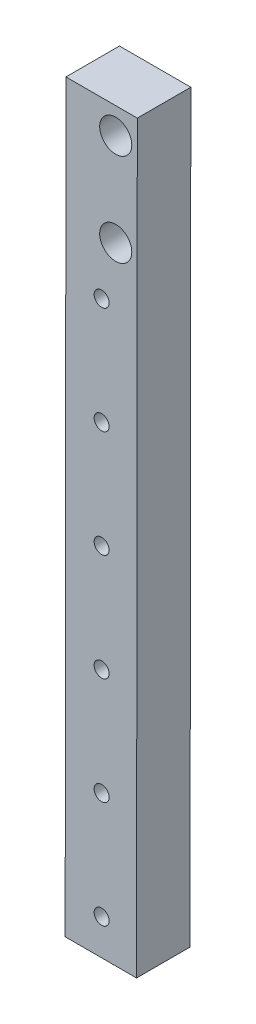
ISO-10303-21;
HEADER;
FILE_DESCRIPTION(('STEP AP214'),'2;1');
FILE_NAME('part.step','',(''),(''),'','','');
FILE_SCHEMA(('AUTOMOTIVE_DESIGN { 1 0 10303 214 1 1 1 1 }'));
ENDSEC;
DATA;
#1=APPLICATION_CONTEXT('core data for automotive mechanical design processes');
#2=APPLICATION_PROTOCOL_DEFINITION('international standard','automotive_design',2000,#1);
#3=PRODUCT_CONTEXT('',#1,'mechanical');
#4=PRODUCT('Part','Part','',(#3));
#5=PRODUCT_RELATED_PRODUCT_CATEGORY('part','',(#4));
#6=PRODUCT_DEFINITION_FORMATION('','',#4);
#7=PRODUCT_DEFINITION_CONTEXT('part definition',#1,'design');
#8=PRODUCT_DEFINITION('design','',#6,#7);
#9=PRODUCT_DEFINITION_SHAPE('','',#8);
#10=(LENGTH_UNIT() NAMED_UNIT(*) SI_UNIT(.MILLI.,.METRE.));
#11=(NAMED_UNIT(*) PLANE_ANGLE_UNIT() SI_UNIT($,.RADIAN.));
#12=(NAMED_UNIT(*) SI_UNIT($,.STERADIAN.) SOLID_ANGLE_UNIT());
#13=UNCERTAINTY_MEASURE_WITH_UNIT(LENGTH_MEASURE(1.E-05),#10,'distance_accuracy_value','');
#14=(GEOMETRIC_REPRESENTATION_CONTEXT(3) GLOBAL_UNCERTAINTY_ASSIGNED_CONTEXT((#13)) GLOBAL_UNIT_ASSIGNED_CONTEXT((#10,
#11,#12)) REPRESENTATION_CONTEXT('',''));
#15=CARTESIAN_POINT('',(0.,0.,0.));
#16=DIRECTION('',(0.,0.,1.));
#17=DIRECTION('',(1.,0.,0.));
#18=AXIS2_PLACEMENT_3D('',#15,#16,#17);
#19=CARTESIAN_POINT('',(18.0396274224274,-0.0185162577234776,15.));
#20=DIRECTION('',(-0.99999947323008,0.00102642075338301,0.));
#21=DIRECTION('',(-0.00102642075338301,-0.99999947323008,0.));
#22=AXIS2_PLACEMENT_3D('',#19,#20,#21);
#23=PLANE('',#22);
#24=DIRECTION('',(0.00102642075338301,0.99999947323008,0.));
#25=VECTOR('',#24,1.);
#26=CARTESIAN_POINT('',(18.0396274224274,-0.0185162577234776,0.));
#27=LINE('',#26,#25);
#28=CARTESIAN_POINT('',(17.8856557995206,-150.026728086736,0.));
#29=VERTEX_POINT('',#28);
#30=CARTESIAN_POINT('',(18.1,58.8,0.));
#31=VERTEX_POINT('',#30);
#32=EDGE_CURVE('E121',#29,#31,#27,.T.);
#33=ORIENTED_EDGE('',*,*,#32,.F.);
#34=DIRECTION('',(0.,0.,-1.));
#35=VECTOR('',#34,1.);
#36=CARTESIAN_POINT('',(17.8856557995206,-150.026728086736,15.));
#37=LINE('',#36,#35);
#38=CARTESIAN_POINT('',(17.8856557995206,-150.026728086736,15.));
#39=VERTEX_POINT('',#38);
#40=EDGE_CURVE('E11',#39,#29,#37,.T.);
#41=ORIENTED_EDGE('',*,*,#40,.F.);
#42=DIRECTION('',(0.00102642075338301,0.99999947323008,0.));
#43=VECTOR('',#42,1.);
#44=CARTESIAN_POINT('',(18.0396274224274,-0.0185162577234776,15.));
#45=LINE('',#44,#43);
#46=CARTESIAN_POINT('',(18.1,58.8,15.));
#47=VERTEX_POINT('',#46);
#48=EDGE_CURVE('E82',#39,#47,#45,.T.);
#49=ORIENTED_EDGE('',*,*,#48,.T.);
#50=DIRECTION('',(0.,0.,-1.));
#51=VECTOR('',#50,1.);
#52=CARTESIAN_POINT('',(18.1,58.8,15.));
#53=LINE('',#52,#51);
#54=EDGE_CURVE('E49',#47,#31,#53,.T.);
#55=ORIENTED_EDGE('',*,*,#54,.T.);
#56=EDGE_LOOP('',(#33,#41,#49,#55));
#57=FACE_BOUND('',#56,.T.);
#58=ADVANCED_FACE('F33',(#57),#23,.T.);
#59=CARTESIAN_POINT('',(0.,-150.026728086736,15.));
#60=DIRECTION('',(0.,1.,0.));
#61=DIRECTION('',(0.,0.,1.));
#62=AXIS2_PLACEMENT_3D('',#59,#60,#61);
#63=PLANE('',#62);
#64=DIRECTION('',(1.,0.,0.));
#65=VECTOR('',#64,1.);
#66=CARTESIAN_POINT('',(0.,-150.026728086736,0.));
#67=LINE('',#66,#65);
#68=CARTESIAN_POINT('',(37.8856557995206,-150.026728086736,0.));
#69=VERTEX_POINT('',#68);
#70=EDGE_CURVE('E88',#29,#69,#67,.T.);
#71=ORIENTED_EDGE('',*,*,#70,.T.);
#72=DIRECTION('',(0.,0.,-1.));
#73=VECTOR('',#72,1.);
#74=CARTESIAN_POINT('',(37.8856557995206,-150.026728086736,15.));
#75=LINE('',#74,#73);
#76=CARTESIAN_POINT('',(37.8856557995206,-150.026728086736,15.));
#77=VERTEX_POINT('',#76);
#78=EDGE_CURVE('E41',#77,#69,#75,.T.);
#79=ORIENTED_EDGE('',*,*,#78,.F.);
#80=DIRECTION('',(1.,0.,0.));
#81=VECTOR('',#80,1.);
#82=CARTESIAN_POINT('',(0.,-150.026728086736,15.));
#83=LINE('',#82,#81);
#84=EDGE_CURVE('E75',#39,#77,#83,.T.);
#85=ORIENTED_EDGE('',*,*,#84,.F.);
#86=ORIENTED_EDGE('',*,*,#40,.T.);
#87=EDGE_LOOP('',(#71,#79,#85,#86));
#88=FACE_BOUND('',#87,.T.);
#89=ADVANCED_FACE('F86',(#88),#63,.F.);
#90=CARTESIAN_POINT('',(38.0396063516362,-0.0390446619773915,15.));
#91=DIRECTION('',(0.99999947323008,-0.00102642075338305,0.));
#92=DIRECTION('',(0.00102642075338305,0.99999947323008,0.));
#93=AXIS2_PLACEMENT_3D('',#90,#91,#92);
#94=PLANE('',#93);
#95=DIRECTION('',(-0.00102642075338305,-0.99999947323008,0.));
#96=VECTOR('',#95,1.);
#97=CARTESIAN_POINT('',(38.0396063516362,-0.0390446619773915,0.));
#98=LINE('',#97,#96);
#99=CARTESIAN_POINT('',(38.1,58.8,0.));
#100=VERTEX_POINT('',#99);
#101=EDGE_CURVE('E124',#100,#69,#98,.T.);
#102=ORIENTED_EDGE('',*,*,#101,.F.);
#103=DIRECTION('',(0.,0.,-1.));
#104=VECTOR('',#103,1.);
#105=CARTESIAN_POINT('',(38.1,58.8,15.));
#106=LINE('',#105,#104);
#107=CARTESIAN_POINT('',(38.1,58.8,15.));
#108=VERTEX_POINT('',#107);
#109=EDGE_CURVE('E62',#108,#100,#106,.T.);
#110=ORIENTED_EDGE('',*,*,#109,.F.);
#111=DIRECTION('',(-0.00102642075338305,-0.99999947323008,0.));
#112=VECTOR('',#111,1.);
#113=CARTESIAN_POINT('',(38.0396063516362,-0.0390446619773915,15.));
#114=LINE('',#113,#112);
#115=EDGE_CURVE('E81',#108,#77,#114,.T.);
#116=ORIENTED_EDGE('',*,*,#115,.T.);
#117=ORIENTED_EDGE('',*,*,#78,.T.);
#118=EDGE_LOOP('',(#102,#110,#116,#117));
#119=FACE_BOUND('',#118,.T.);
#120=ADVANCED_FACE('F91',(#119),#94,.T.);
#121=CARTESIAN_POINT('',(28.0999999999998,-80.026728086736,15.));
#122=DIRECTION('',(0.,0.,-1.));
#123=DIRECTION('',(-1.,0.,0.));
#124=AXIS2_PLACEMENT_3D('',#121,#122,#123);
#125=CYLINDRICAL_SURFACE('',#124,2.1);
#126=CARTESIAN_POINT('',(28.0999999999998,-80.026728086736,15.));
#127=DIRECTION('',(0.,0.,1.));
#128=DIRECTION('',(1.,0.,0.));
#129=AXIS2_PLACEMENT_3D('',#126,#127,#128);
#130=CIRCLE('',#129,2.1);
#131=CARTESIAN_POINT('',(30.1999999999998,-80.026728086736,15.));
#132=VERTEX_POINT('',#131);
#133=EDGE_CURVE('E115',#132,#132,#130,.F.);
#134=ORIENTED_EDGE('',*,*,#133,.F.);
#135=EDGE_LOOP('',(#134));
#136=FACE_BOUND('',#135,.T.);
#137=CARTESIAN_POINT('',(28.0999999999998,-80.026728086736,0.));
#138=DIRECTION('',(0.,0.,1.));
#139=DIRECTION('',(1.,0.,0.));
#140=AXIS2_PLACEMENT_3D('',#137,#138,#139);
#141=CIRCLE('',#140,2.1);
#142=CARTESIAN_POINT('',(30.1999999999998,-80.026728086736,0.));
#143=VERTEX_POINT('',#142);
#144=EDGE_CURVE('E147',#143,#143,#141,.F.);
#145=ORIENTED_EDGE('',*,*,#144,.T.);
#146=EDGE_LOOP('',(#145));
#147=FACE_BOUND('',#146,.T.);
#148=ADVANCED_FACE('F178',(#136,#147),#125,.F.);
#149=CARTESIAN_POINT('',(28.0999999999996,-20.026728086736,15.));
#150=DIRECTION('',(0.,0.,-1.));
#151=DIRECTION('',(-1.,0.,0.));
#152=AXIS2_PLACEMENT_3D('',#149,#150,#151);
#153=CYLINDRICAL_SURFACE('',#152,2.1);
#154=CARTESIAN_POINT('',(28.0999999999996,-20.026728086736,15.));
#155=DIRECTION('',(0.,0.,1.));
#156=DIRECTION('',(1.,0.,0.));
#157=AXIS2_PLACEMENT_3D('',#154,#155,#156);
#158=CIRCLE('',#157,2.1);
#159=CARTESIAN_POINT('',(30.1999999999996,-20.026728086736,15.));
#160=VERTEX_POINT('',#159);
#161=EDGE_CURVE('E112',#160,#160,#158,.F.);
#162=ORIENTED_EDGE('',*,*,#161,.F.);
#163=EDGE_LOOP('',(#162));
#164=FACE_BOUND('',#163,.T.);
#165=CARTESIAN_POINT('',(28.0999999999996,-20.026728086736,0.));
#166=DIRECTION('',(0.,0.,1.));
#167=DIRECTION('',(1.,0.,0.));
#168=AXIS2_PLACEMENT_3D('',#165,#166,#167);
#169=CIRCLE('',#168,2.1);
#170=CARTESIAN_POINT('',(30.1999999999996,-20.026728086736,0.));
#171=VERTEX_POINT('',#170);
#172=EDGE_CURVE('E144',#171,#171,#169,.F.);
#173=ORIENTED_EDGE('',*,*,#172,.T.);
#174=EDGE_LOOP('',(#173));
#175=FACE_BOUND('',#174,.T.);
#176=ADVANCED_FACE('F182',(#164,#175),#153,.F.);
#177=CARTESIAN_POINT('',(32.0499999999999,51.5,15.));
#178=DIRECTION('',(0.,0.,-1.));
#179=DIRECTION('',(-1.,0.,0.));
#180=AXIS2_PLACEMENT_3D('',#177,#178,#179);
#181=CYLINDRICAL_SURFACE('',#180,4.5);
#182=CARTESIAN_POINT('',(32.0499999999999,51.5,15.));
#183=DIRECTION('',(0.,0.,1.));
#184=DIRECTION('',(1.,0.,0.));
#185=AXIS2_PLACEMENT_3D('',#182,#183,#184);
#186=CIRCLE('',#185,4.5);
#187=CARTESIAN_POINT('',(36.5499999999999,51.5,15.));
#188=VERTEX_POINT('',#187);
#189=EDGE_CURVE('E109',#188,#188,#186,.F.);
#190=ORIENTED_EDGE('',*,*,#189,.F.);
#191=EDGE_LOOP('',(#190));
#192=FACE_BOUND('',#191,.T.);
#193=CARTESIAN_POINT('',(32.0499999999999,51.5,0.));
#194=DIRECTION('',(0.,0.,1.));
#195=DIRECTION('',(1.,0.,0.));
#196=AXIS2_PLACEMENT_3D('',#193,#194,#195);
#197=CIRCLE('',#196,4.5);
#198=CARTESIAN_POINT('',(36.5499999999999,51.5,0.));
#199=VERTEX_POINT('',#198);
#200=EDGE_CURVE('E141',#199,#199,#197,.F.);
#201=ORIENTED_EDGE('',*,*,#200,.T.);
#202=EDGE_LOOP('',(#201));
#203=FACE_BOUND('',#202,.T.);
#204=ADVANCED_FACE('F188',(#192,#203),#181,.F.);
#205=CARTESIAN_POINT('',(32.05,25.5,15.));
#206=DIRECTION('',(0.,0.,-1.));
#207=DIRECTION('',(-1.,0.,0.));
#208=AXIS2_PLACEMENT_3D('',#205,#206,#207);
#209=CYLINDRICAL_SURFACE('',#208,4.5);
#210=CARTESIAN_POINT('',(32.05,25.5,15.));
#211=DIRECTION('',(0.,0.,1.));
#212=DIRECTION('',(1.,0.,0.));
#213=AXIS2_PLACEMENT_3D('',#210,#211,#212);
#214=CIRCLE('',#213,4.5);
#215=CARTESIAN_POINT('',(36.55,25.5,15.));
#216=VERTEX_POINT('',#215);
#217=EDGE_CURVE('E106',#216,#216,#214,.F.);
#218=ORIENTED_EDGE('',*,*,#217,.F.);
#219=EDGE_LOOP('',(#218));
#220=FACE_BOUND('',#219,.T.);
#221=CARTESIAN_POINT('',(32.05,25.5,0.));
#222=DIRECTION('',(0.,0.,1.));
#223=DIRECTION('',(1.,0.,0.));
#224=AXIS2_PLACEMENT_3D('',#221,#222,#223);
#225=CIRCLE('',#224,4.5);
#226=CARTESIAN_POINT('',(36.55,25.5,0.));
#227=VERTEX_POINT('',#226);
#228=EDGE_CURVE('E138',#227,#227,#225,.F.);
#229=ORIENTED_EDGE('',*,*,#228,.T.);
#230=EDGE_LOOP('',(#229));
#231=FACE_BOUND('',#230,.T.);
#232=ADVANCED_FACE('F197',(#220,#231),#209,.F.);
#233=CARTESIAN_POINT('',(28.0999999999995,9.973271913264,15.));
#234=DIRECTION('',(0.,0.,-1.));
#235=DIRECTION('',(-1.,0.,0.));
#236=AXIS2_PLACEMENT_3D('',#233,#234,#235);
#237=CYLINDRICAL_SURFACE('',#236,2.1);
#238=CARTESIAN_POINT('',(28.0999999999995,9.973271913264,15.));
#239=DIRECTION('',(0.,0.,1.));
#240=DIRECTION('',(1.,0.,0.));
#241=AXIS2_PLACEMENT_3D('',#238,#239,#240);
#242=CIRCLE('',#241,2.1);
#243=CARTESIAN_POINT('',(30.1999999999995,9.973271913264,15.));
#244=VERTEX_POINT('',#243);
#245=EDGE_CURVE('E103',#244,#244,#242,.F.);
#246=ORIENTED_EDGE('',*,*,#245,.F.);
#247=EDGE_LOOP('',(#246));
#248=FACE_BOUND('',#247,.T.);
#249=CARTESIAN_POINT('',(28.0999999999995,9.973271913264,0.));
#250=DIRECTION('',(0.,0.,1.));
#251=DIRECTION('',(1.,0.,0.));
#252=AXIS2_PLACEMENT_3D('',#249,#250,#251);
#253=CIRCLE('',#252,2.1);
#254=CARTESIAN_POINT('',(30.1999999999995,9.973271913264,0.));
#255=VERTEX_POINT('',#254);
#256=EDGE_CURVE('E135',#255,#255,#253,.F.);
#257=ORIENTED_EDGE('',*,*,#256,.T.);
#258=EDGE_LOOP('',(#257));
#259=FACE_BOUND('',#258,.T.);
#260=ADVANCED_FACE('F201',(#248,#259),#237,.F.);
#261=CARTESIAN_POINT('',(28.0999999999997,-50.026728086736,15.));
#262=DIRECTION('',(0.,0.,-1.));
#263=DIRECTION('',(-1.,0.,0.));
#264=AXIS2_PLACEMENT_3D('',#261,#262,#263);
#265=CYLINDRICAL_SURFACE('',#264,2.1);
#266=CARTESIAN_POINT('',(28.0999999999997,-50.026728086736,15.));
#267=DIRECTION('',(0.,0.,1.));
#268=DIRECTION('',(1.,0.,0.));
#269=AXIS2_PLACEMENT_3D('',#266,#267,#268);
#270=CIRCLE('',#269,2.1);
#271=CARTESIAN_POINT('',(30.1999999999997,-50.026728086736,15.));
#272=VERTEX_POINT('',#271);
#273=EDGE_CURVE('E100',#272,#272,#270,.F.);
#274=ORIENTED_EDGE('',*,*,#273,.F.);
#275=EDGE_LOOP('',(#274));
#276=FACE_BOUND('',#275,.T.);
#277=CARTESIAN_POINT('',(28.0999999999997,-50.026728086736,0.));
#278=DIRECTION('',(0.,0.,1.));
#279=DIRECTION('',(1.,0.,0.));
#280=AXIS2_PLACEMENT_3D('',#277,#278,#279);
#281=CIRCLE('',#280,2.1);
#282=CARTESIAN_POINT('',(30.1999999999997,-50.026728086736,0.));
#283=VERTEX_POINT('',#282);
#284=EDGE_CURVE('E132',#283,#283,#281,.F.);
#285=ORIENTED_EDGE('',*,*,#284,.T.);
#286=EDGE_LOOP('',(#285));
#287=FACE_BOUND('',#286,.T.);
#288=ADVANCED_FACE('F167',(#276,#287),#265,.F.);
#289=CARTESIAN_POINT('',(28.0999999999999,-110.026728086736,15.));
#290=DIRECTION('',(0.,0.,-1.));
#291=DIRECTION('',(-1.,0.,0.));
#292=AXIS2_PLACEMENT_3D('',#289,#290,#291);
#293=CYLINDRICAL_SURFACE('',#292,2.1);
#294=CARTESIAN_POINT('',(28.0999999999999,-110.026728086736,15.));
#295=DIRECTION('',(0.,0.,1.));
#296=DIRECTION('',(1.,0.,0.));
#297=AXIS2_PLACEMENT_3D('',#294,#295,#296);
#298=CIRCLE('',#297,2.1);
#299=CARTESIAN_POINT('',(30.1999999999999,-110.026728086736,15.));
#300=VERTEX_POINT('',#299);
#301=EDGE_CURVE('E94',#300,#300,#298,.F.);
#302=ORIENTED_EDGE('',*,*,#301,.F.);
#303=EDGE_LOOP('',(#302));
#304=FACE_BOUND('',#303,.T.);
#305=CARTESIAN_POINT('',(28.0999999999999,-110.026728086736,0.));
#306=DIRECTION('',(0.,0.,1.));
#307=DIRECTION('',(1.,0.,0.));
#308=AXIS2_PLACEMENT_3D('',#305,#306,#307);
#309=CIRCLE('',#308,2.1);
#310=CARTESIAN_POINT('',(30.1999999999999,-110.026728086736,0.));
#311=VERTEX_POINT('',#310);
#312=EDGE_CURVE('E129',#311,#311,#309,.F.);
#313=ORIENTED_EDGE('',*,*,#312,.T.);
#314=EDGE_LOOP('',(#313));
#315=FACE_BOUND('',#314,.T.);
#316=ADVANCED_FACE('F159',(#304,#315),#293,.F.);
#317=CARTESIAN_POINT('',(4.30211422042248E-13,58.8000000000002,15.));
#318=DIRECTION('',(0.,1.,0.));
#319=DIRECTION('',(-1.,0.,0.));
#320=AXIS2_PLACEMENT_3D('',#317,#318,#319);
#321=PLANE('',#320);
#322=DIRECTION('',(1.,0.,0.));
#323=VECTOR('',#322,1.);
#324=CARTESIAN_POINT('',(4.30211422042248E-13,58.8000000000002,0.));
#325=LINE('',#324,#323);
#326=EDGE_CURVE('E126',#31,#100,#325,.T.);
#327=ORIENTED_EDGE('',*,*,#326,.F.);
#328=ORIENTED_EDGE('',*,*,#54,.F.);
#329=DIRECTION('',(1.,0.,0.));
#330=VECTOR('',#329,1.);
#331=CARTESIAN_POINT('',(4.30211422042248E-13,58.8000000000002,15.));
#332=LINE('',#331,#330);
#333=EDGE_CURVE('E92',#47,#108,#332,.T.);
#334=ORIENTED_EDGE('',*,*,#333,.T.);
#335=ORIENTED_EDGE('',*,*,#109,.T.);
#336=EDGE_LOOP('',(#327,#328,#334,#335));
#337=FACE_BOUND('',#336,.T.);
#338=ADVANCED_FACE('F156',(#337),#321,.T.);
#339=CARTESIAN_POINT('',(28.1,-140.026728086736,15.));
#340=DIRECTION('',(0.,0.,-1.));
#341=DIRECTION('',(-1.,0.,0.));
#342=AXIS2_PLACEMENT_3D('',#339,#340,#341);
#343=CYLINDRICAL_SURFACE('',#342,2.1);
#344=CARTESIAN_POINT('',(28.1,-140.026728086736,15.));
#345=DIRECTION('',(0.,0.,1.));
#346=DIRECTION('',(1.,0.,0.));
#347=AXIS2_PLACEMENT_3D('',#344,#345,#346);
#348=CIRCLE('',#347,2.1);
#349=CARTESIAN_POINT('',(30.2,-140.026728086736,15.));
#350=VERTEX_POINT('',#349);
#351=EDGE_CURVE('E118',#350,#350,#348,.F.);
#352=ORIENTED_EDGE('',*,*,#351,.F.);
#353=EDGE_LOOP('',(#352));
#354=FACE_BOUND('',#353,.T.);
#355=CARTESIAN_POINT('',(28.1,-140.026728086736,0.));
#356=DIRECTION('',(0.,0.,1.));
#357=DIRECTION('',(1.,0.,0.));
#358=AXIS2_PLACEMENT_3D('',#355,#356,#357);
#359=CIRCLE('',#358,2.1);
#360=CARTESIAN_POINT('',(30.2,-140.026728086736,0.));
#361=VERTEX_POINT('',#360);
#362=EDGE_CURVE('E150',#361,#361,#359,.F.);
#363=ORIENTED_EDGE('',*,*,#362,.T.);
#364=EDGE_LOOP('',(#363));
#365=FACE_BOUND('',#364,.T.);
#366=ADVANCED_FACE('F158',(#354,#365),#343,.F.);
#367=CARTESIAN_POINT('',(0.,0.,15.));
#368=DIRECTION('',(0.,0.,1.));
#369=DIRECTION('',(1.,0.,0.));
#370=AXIS2_PLACEMENT_3D('',#367,#368,#369);
#371=PLANE('',#370);
#372=ORIENTED_EDGE('',*,*,#48,.F.);
#373=ORIENTED_EDGE('',*,*,#84,.T.);
#374=ORIENTED_EDGE('',*,*,#115,.F.);
#375=ORIENTED_EDGE('',*,*,#333,.F.);
#376=EDGE_LOOP('',(#372,#373,#374,#375));
#377=FACE_BOUND('',#376,.T.);
#378=ORIENTED_EDGE('',*,*,#301,.T.);
#379=EDGE_LOOP('',(#378));
#380=FACE_BOUND('',#379,.T.);
#381=ORIENTED_EDGE('',*,*,#273,.T.);
#382=EDGE_LOOP('',(#381));
#383=FACE_BOUND('',#382,.T.);
#384=ORIENTED_EDGE('',*,*,#245,.T.);
#385=EDGE_LOOP('',(#384));
#386=FACE_BOUND('',#385,.T.);
#387=ORIENTED_EDGE('',*,*,#217,.T.);
#388=EDGE_LOOP('',(#387));
#389=FACE_BOUND('',#388,.T.);
#390=ORIENTED_EDGE('',*,*,#189,.T.);
#391=EDGE_LOOP('',(#390));
#392=FACE_BOUND('',#391,.T.);
#393=ORIENTED_EDGE('',*,*,#161,.T.);
#394=EDGE_LOOP('',(#393));
#395=FACE_BOUND('',#394,.T.);
#396=ORIENTED_EDGE('',*,*,#133,.T.);
#397=EDGE_LOOP('',(#396));
#398=FACE_BOUND('',#397,.T.);
#399=ORIENTED_EDGE('',*,*,#351,.T.);
#400=EDGE_LOOP('',(#399));
#401=FACE_BOUND('',#400,.T.);
#402=ADVANCED_FACE('F77',(#377,#380,#383,#386,#389,#392,#395,#398,#401),#371,.T.);
#403=CARTESIAN_POINT('',(0.,0.,0.));
#404=DIRECTION('',(0.,0.,1.));
#405=DIRECTION('',(1.,0.,0.));
#406=AXIS2_PLACEMENT_3D('',#403,#404,#405);
#407=PLANE('',#406);
#408=ORIENTED_EDGE('',*,*,#32,.T.);
#409=ORIENTED_EDGE('',*,*,#326,.T.);
#410=ORIENTED_EDGE('',*,*,#101,.T.);
#411=ORIENTED_EDGE('',*,*,#70,.F.);
#412=EDGE_LOOP('',(#408,#409,#410,#411));
#413=FACE_BOUND('',#412,.T.);
#414=ORIENTED_EDGE('',*,*,#312,.F.);
#415=EDGE_LOOP('',(#414));
#416=FACE_BOUND('',#415,.T.);
#417=ORIENTED_EDGE('',*,*,#284,.F.);
#418=EDGE_LOOP('',(#417));
#419=FACE_BOUND('',#418,.T.);
#420=ORIENTED_EDGE('',*,*,#256,.F.);
#421=EDGE_LOOP('',(#420));
#422=FACE_BOUND('',#421,.T.);
#423=ORIENTED_EDGE('',*,*,#228,.F.);
#424=EDGE_LOOP('',(#423));
#425=FACE_BOUND('',#424,.T.);
#426=ORIENTED_EDGE('',*,*,#200,.F.);
#427=EDGE_LOOP('',(#426));
#428=FACE_BOUND('',#427,.T.);
#429=ORIENTED_EDGE('',*,*,#172,.F.);
#430=EDGE_LOOP('',(#429));
#431=FACE_BOUND('',#430,.T.);
#432=ORIENTED_EDGE('',*,*,#144,.F.);
#433=EDGE_LOOP('',(#432));
#434=FACE_BOUND('',#433,.T.);
#435=ORIENTED_EDGE('',*,*,#362,.F.);
#436=EDGE_LOOP('',(#435));
#437=FACE_BOUND('',#436,.T.);
#438=ADVANCED_FACE('F214',(#413,#416,#419,#422,#425,#428,#431,#434,#437),#407,.F.);
#439=CLOSED_SHELL('',(#58,#89,#120,#148,#176,#204,#232,#260,#288,#316,#338,#366,#402,#438));
#440=MANIFOLD_SOLID_BREP('B2',#439);
#441=ADVANCED_BREP_SHAPE_REPRESENTATION('',(#18,#440),#14);
#442=SHAPE_DEFINITION_REPRESENTATION(#9,#441);
ENDSEC;
END-ISO-10303-21;
